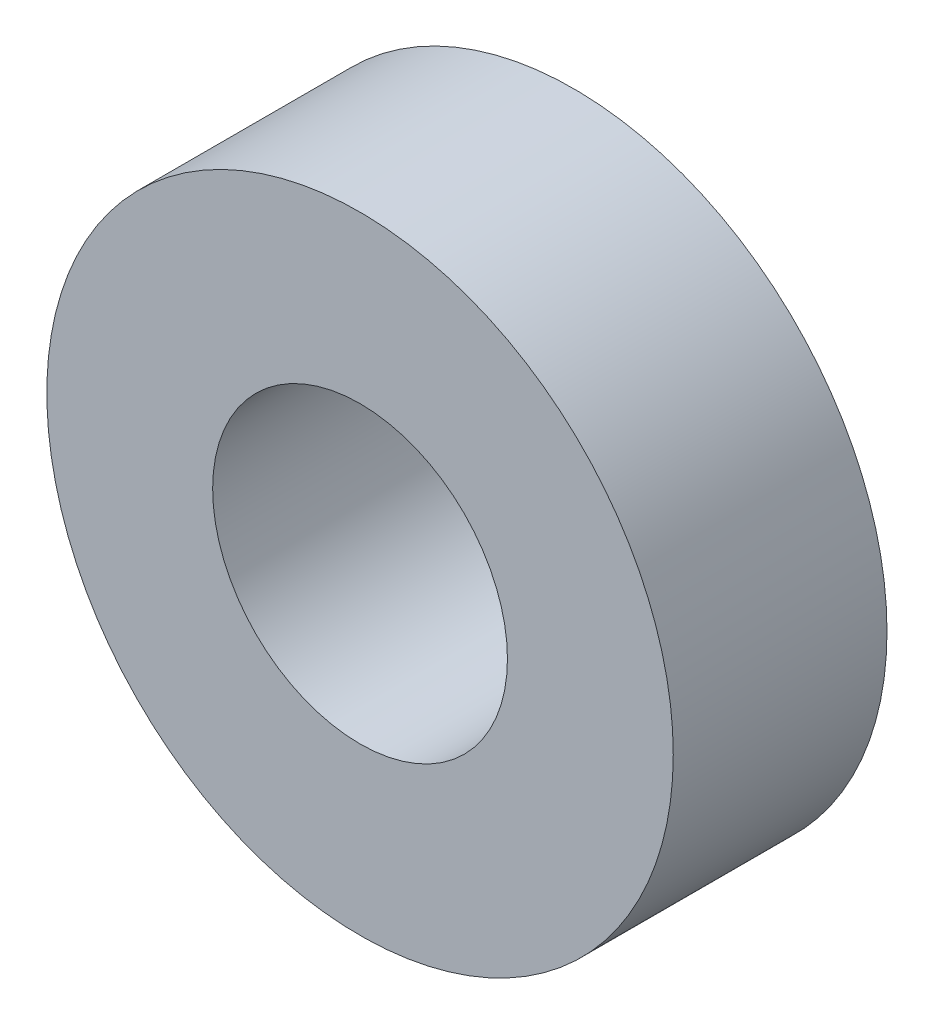
ISO-10303-21;
HEADER;
FILE_DESCRIPTION(('STEP AP214'),'2;1');
FILE_NAME('part.step','',(''),(''),'','','');
FILE_SCHEMA(('AUTOMOTIVE_DESIGN { 1 0 10303 214 1 1 1 1 }'));
ENDSEC;
DATA;
#1=APPLICATION_CONTEXT('core data for automotive mechanical design processes');
#2=APPLICATION_PROTOCOL_DEFINITION('international standard','automotive_design',2000,#1);
#3=PRODUCT_CONTEXT('',#1,'mechanical');
#4=PRODUCT('Part','Part','',(#3));
#5=PRODUCT_RELATED_PRODUCT_CATEGORY('part','',(#4));
#6=PRODUCT_DEFINITION_FORMATION('','',#4);
#7=PRODUCT_DEFINITION_CONTEXT('part definition',#1,'design');
#8=PRODUCT_DEFINITION('design','',#6,#7);
#9=PRODUCT_DEFINITION_SHAPE('','',#8);
#10=(LENGTH_UNIT() NAMED_UNIT(*) SI_UNIT(.MILLI.,.METRE.));
#11=(NAMED_UNIT(*) PLANE_ANGLE_UNIT() SI_UNIT($,.RADIAN.));
#12=(NAMED_UNIT(*) SI_UNIT($,.STERADIAN.) SOLID_ANGLE_UNIT());
#13=UNCERTAINTY_MEASURE_WITH_UNIT(LENGTH_MEASURE(1.E-05),#10,'distance_accuracy_value','');
#14=(GEOMETRIC_REPRESENTATION_CONTEXT(3) GLOBAL_UNCERTAINTY_ASSIGNED_CONTEXT((#13)) GLOBAL_UNIT_ASSIGNED_CONTEXT((#10,
#11,#12)) REPRESENTATION_CONTEXT('',''));
#15=CARTESIAN_POINT('',(0.,0.,0.));
#16=DIRECTION('',(0.,0.,1.));
#17=DIRECTION('',(1.,0.,0.));
#18=AXIS2_PLACEMENT_3D('',#15,#16,#17);
#19=CARTESIAN_POINT('',(0.,0.,5.8));
#20=DIRECTION('',(0.,0.,1.));
#21=DIRECTION('',(1.,0.,0.));
#22=AXIS2_PLACEMENT_3D('',#19,#20,#21);
#23=PLANE('',#22);
#24=CARTESIAN_POINT('',(0.,0.,5.8));
#25=DIRECTION('',(0.,0.,1.));
#26=DIRECTION('',(1.,0.,0.));
#27=AXIS2_PLACEMENT_3D('',#24,#25,#26);
#28=CIRCLE('',#27,8.5);
#29=CARTESIAN_POINT('',(8.5,0.,5.8));
#30=VERTEX_POINT('',#29);
#31=EDGE_CURVE('E10',#30,#30,#28,.T.);
#32=ORIENTED_EDGE('',*,*,#31,.T.);
#33=EDGE_LOOP('',(#32));
#34=FACE_BOUND('',#33,.T.);
#35=CARTESIAN_POINT('',(0.,0.,5.8));
#36=DIRECTION('',(0.,0.,1.));
#37=DIRECTION('',(1.,0.,0.));
#38=AXIS2_PLACEMENT_3D('',#35,#36,#37);
#39=CIRCLE('',#38,4.);
#40=CARTESIAN_POINT('',(4.,0.,5.8));
#41=VERTEX_POINT('',#40);
#42=EDGE_CURVE('E41',#41,#41,#39,.T.);
#43=ORIENTED_EDGE('',*,*,#42,.F.);
#44=EDGE_LOOP('',(#43));
#45=FACE_BOUND('',#44,.T.);
#46=ADVANCED_FACE('F30',(#34,#45),#23,.T.);
#47=CARTESIAN_POINT('',(0.,0.,0.));
#48=DIRECTION('',(0.,0.,1.));
#49=DIRECTION('',(1.,0.,0.));
#50=AXIS2_PLACEMENT_3D('',#47,#48,#49);
#51=PLANE('',#50);
#52=CARTESIAN_POINT('',(0.,0.,0.));
#53=DIRECTION('',(0.,0.,1.));
#54=DIRECTION('',(1.,0.,0.));
#55=AXIS2_PLACEMENT_3D('',#52,#53,#54);
#56=CIRCLE('',#55,8.5);
#57=CARTESIAN_POINT('',(8.5,0.,0.));
#58=VERTEX_POINT('',#57);
#59=EDGE_CURVE('E34',#58,#58,#56,.T.);
#60=ORIENTED_EDGE('',*,*,#59,.F.);
#61=EDGE_LOOP('',(#60));
#62=FACE_BOUND('',#61,.T.);
#63=CARTESIAN_POINT('',(0.,0.,0.));
#64=DIRECTION('',(0.,0.,1.));
#65=DIRECTION('',(1.,0.,0.));
#66=AXIS2_PLACEMENT_3D('',#63,#64,#65);
#67=CIRCLE('',#66,4.);
#68=CARTESIAN_POINT('',(4.,0.,0.));
#69=VERTEX_POINT('',#68);
#70=EDGE_CURVE('E43',#69,#69,#67,.T.);
#71=ORIENTED_EDGE('',*,*,#70,.T.);
#72=EDGE_LOOP('',(#71));
#73=FACE_BOUND('',#72,.T.);
#74=ADVANCED_FACE('F53',(#62,#73),#51,.F.);
#75=CARTESIAN_POINT('',(0.,0.,5.8));
#76=DIRECTION('',(0.,0.,-1.));
#77=DIRECTION('',(-1.,0.,0.));
#78=AXIS2_PLACEMENT_3D('',#75,#76,#77);
#79=CYLINDRICAL_SURFACE('',#78,8.5);
#80=ORIENTED_EDGE('',*,*,#31,.F.);
#81=EDGE_LOOP('',(#80));
#82=FACE_BOUND('',#81,.T.);
#83=ORIENTED_EDGE('',*,*,#59,.T.);
#84=EDGE_LOOP('',(#83));
#85=FACE_BOUND('',#84,.T.);
#86=ADVANCED_FACE('F32',(#82,#85),#79,.T.);
#87=CARTESIAN_POINT('',(0.,0.,5.8));
#88=DIRECTION('',(0.,0.,-1.));
#89=DIRECTION('',(-1.,0.,0.));
#90=AXIS2_PLACEMENT_3D('',#87,#88,#89);
#91=CYLINDRICAL_SURFACE('',#90,4.);
#92=ORIENTED_EDGE('',*,*,#42,.T.);
#93=EDGE_LOOP('',(#92));
#94=FACE_BOUND('',#93,.T.);
#95=ORIENTED_EDGE('',*,*,#70,.F.);
#96=EDGE_LOOP('',(#95));
#97=FACE_BOUND('',#96,.T.);
#98=ADVANCED_FACE('F49',(#94,#97),#91,.F.);
#99=CLOSED_SHELL('',(#46,#74,#86,#98));
#100=MANIFOLD_SOLID_BREP('B2',#99);
#101=ADVANCED_BREP_SHAPE_REPRESENTATION('',(#18,#100),#14);
#102=SHAPE_DEFINITION_REPRESENTATION(#9,#101);
ENDSEC;
END-ISO-10303-21;
